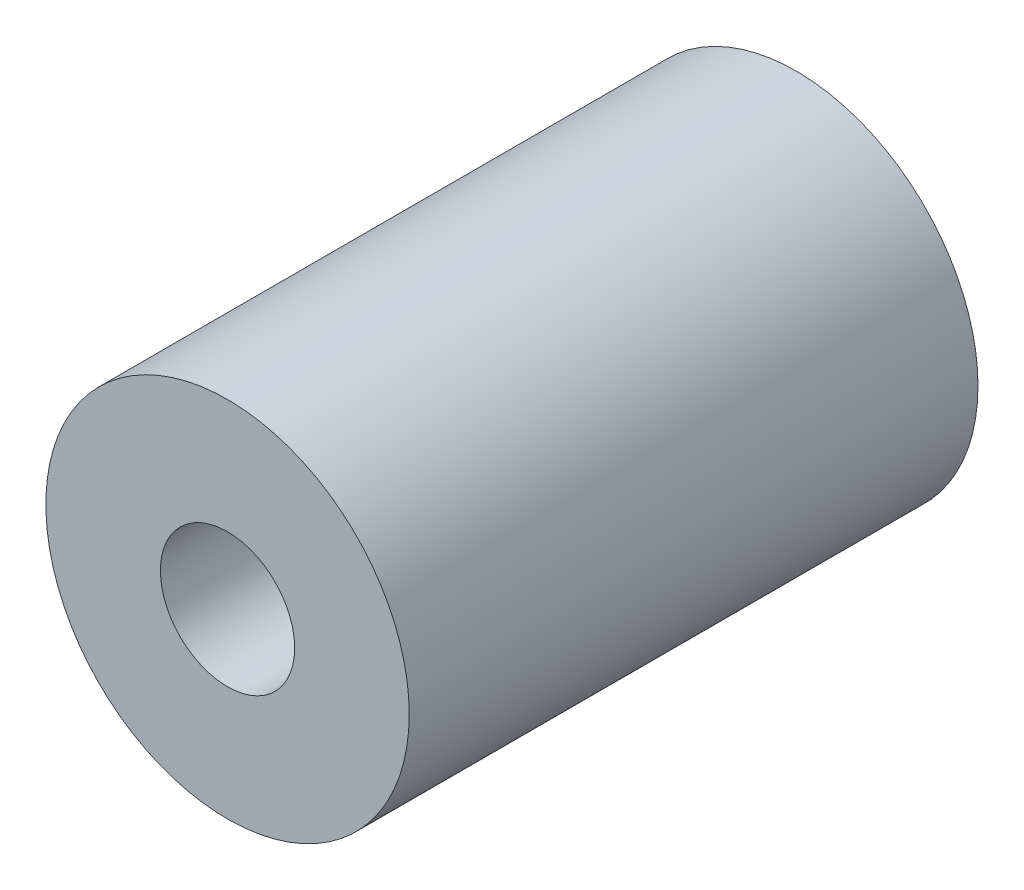
ISO-10303-21;
HEADER;
FILE_DESCRIPTION(('STEP AP214'),'2;1');
FILE_NAME('part.step','',(''),(''),'','','');
FILE_SCHEMA(('AUTOMOTIVE_DESIGN { 1 0 10303 214 1 1 1 1 }'));
ENDSEC;
DATA;
#1=APPLICATION_CONTEXT('core data for automotive mechanical design processes');
#2=APPLICATION_PROTOCOL_DEFINITION('international standard','automotive_design',2000,#1);
#3=PRODUCT_CONTEXT('',#1,'mechanical');
#4=PRODUCT('Part','Part','',(#3));
#5=PRODUCT_RELATED_PRODUCT_CATEGORY('part','',(#4));
#6=PRODUCT_DEFINITION_FORMATION('','',#4);
#7=PRODUCT_DEFINITION_CONTEXT('part definition',#1,'design');
#8=PRODUCT_DEFINITION('design','',#6,#7);
#9=PRODUCT_DEFINITION_SHAPE('','',#8);
#10=(LENGTH_UNIT() NAMED_UNIT(*) SI_UNIT(.MILLI.,.METRE.));
#11=(NAMED_UNIT(*) PLANE_ANGLE_UNIT() SI_UNIT($,.RADIAN.));
#12=(NAMED_UNIT(*) SI_UNIT($,.STERADIAN.) SOLID_ANGLE_UNIT());
#13=UNCERTAINTY_MEASURE_WITH_UNIT(LENGTH_MEASURE(1.E-05),#10,'distance_accuracy_value','');
#14=(GEOMETRIC_REPRESENTATION_CONTEXT(3) GLOBAL_UNCERTAINTY_ASSIGNED_CONTEXT((#13)) GLOBAL_UNIT_ASSIGNED_CONTEXT((#10,
#11,#12)) REPRESENTATION_CONTEXT('',''));
#15=CARTESIAN_POINT('',(0.,0.,0.));
#16=DIRECTION('',(0.,0.,1.));
#17=DIRECTION('',(1.,0.,0.));
#18=AXIS2_PLACEMENT_3D('',#15,#16,#17);
#19=CARTESIAN_POINT('',(0.,0.,7.2));
#20=DIRECTION('',(0.,0.,-1.));
#21=DIRECTION('',(-1.00000000000001,0.,0.));
#22=AXIS2_PLACEMENT_3D('',#19,#20,#21);
#23=CYLINDRICAL_SURFACE('',#22,2.3);
#24=CARTESIAN_POINT('',(0.,0.,7.2));
#25=DIRECTION('',(0.,0.,1.));
#26=DIRECTION('',(1.00000000000001,0.,0.));
#27=AXIS2_PLACEMENT_3D('',#24,#25,#26);
#28=CIRCLE('',#27,2.3);
#29=CARTESIAN_POINT('',(2.30000000000001,0.,7.2));
#30=VERTEX_POINT('',#29);
#31=EDGE_CURVE('E10',#30,#30,#28,.T.);
#32=ORIENTED_EDGE('',*,*,#31,.F.);
#33=EDGE_LOOP('',(#32));
#34=FACE_BOUND('',#33,.T.);
#35=CARTESIAN_POINT('',(0.,0.,0.));
#36=DIRECTION('',(0.,0.,1.));
#37=DIRECTION('',(1.00000000000001,0.,0.));
#38=AXIS2_PLACEMENT_3D('',#35,#36,#37);
#39=CIRCLE('',#38,2.3);
#40=CARTESIAN_POINT('',(2.30000000000001,0.,0.));
#41=VERTEX_POINT('',#40);
#42=EDGE_CURVE('E33',#41,#41,#39,.T.);
#43=ORIENTED_EDGE('',*,*,#42,.T.);
#44=EDGE_LOOP('',(#43));
#45=FACE_BOUND('',#44,.T.);
#46=ADVANCED_FACE('F30',(#34,#45),#23,.T.);
#47=CARTESIAN_POINT('',(0.,0.,7.2));
#48=DIRECTION('',(0.,0.,1.));
#49=DIRECTION('',(1.00000000000001,0.,0.));
#50=AXIS2_PLACEMENT_3D('',#47,#48,#49);
#51=PLANE('',#50);
#52=CARTESIAN_POINT('',(0.,0.,7.2));
#53=DIRECTION('',(0.,0.,1.));
#54=DIRECTION('',(1.00000000000001,0.,0.));
#55=AXIS2_PLACEMENT_3D('',#52,#53,#54);
#56=CIRCLE('',#55,0.85);
#57=CARTESIAN_POINT('',(0.850000000000005,0.,7.2));
#58=VERTEX_POINT('',#57);
#59=EDGE_CURVE('E42',#58,#58,#56,.T.);
#60=ORIENTED_EDGE('',*,*,#59,.F.);
#61=EDGE_LOOP('',(#60));
#62=FACE_BOUND('',#61,.T.);
#63=ORIENTED_EDGE('',*,*,#31,.T.);
#64=EDGE_LOOP('',(#63));
#65=FACE_BOUND('',#64,.T.);
#66=ADVANCED_FACE('F57',(#62,#65),#51,.T.);
#67=CARTESIAN_POINT('',(0.,0.,0.));
#68=DIRECTION('',(0.,0.,1.));
#69=DIRECTION('',(1.00000000000001,0.,0.));
#70=AXIS2_PLACEMENT_3D('',#67,#68,#69);
#71=PLANE('',#70);
#72=ORIENTED_EDGE('',*,*,#42,.F.);
#73=EDGE_LOOP('',(#72));
#74=FACE_BOUND('',#73,.T.);
#75=ADVANCED_FACE('F53',(#74),#71,.F.);
#76=CARTESIAN_POINT('',(0.,0.,3.6));
#77=DIRECTION('',(0.,0.,1.));
#78=DIRECTION('',(1.00000000000001,0.,0.));
#79=AXIS2_PLACEMENT_3D('',#76,#77,#78);
#80=CYLINDRICAL_SURFACE('',#79,0.85);
#81=CARTESIAN_POINT('',(0.,0.,3.6));
#82=DIRECTION('',(0.,0.,1.));
#83=DIRECTION('',(1.00000000000001,0.,0.));
#84=AXIS2_PLACEMENT_3D('',#81,#82,#83);
#85=CIRCLE('',#84,0.85);
#86=CARTESIAN_POINT('',(0.850000000000005,0.,3.6));
#87=VERTEX_POINT('',#86);
#88=EDGE_CURVE('E40',#87,#87,#85,.T.);
#89=ORIENTED_EDGE('',*,*,#88,.F.);
#90=EDGE_LOOP('',(#89));
#91=FACE_BOUND('',#90,.T.);
#92=ORIENTED_EDGE('',*,*,#59,.T.);
#93=EDGE_LOOP('',(#92));
#94=FACE_BOUND('',#93,.T.);
#95=ADVANCED_FACE('F50',(#91,#94),#80,.F.);
#96=CARTESIAN_POINT('',(0.,0.,3.6));
#97=DIRECTION('',(0.,0.,1.));
#98=DIRECTION('',(1.00000000000001,0.,0.));
#99=AXIS2_PLACEMENT_3D('',#96,#97,#98);
#100=PLANE('',#99);
#101=ORIENTED_EDGE('',*,*,#88,.T.);
#102=EDGE_LOOP('',(#101));
#103=FACE_BOUND('',#102,.T.);
#104=ADVANCED_FACE('F48',(#103),#100,.T.);
#105=CLOSED_SHELL('',(#46,#66,#75,#95,#104));
#106=MANIFOLD_SOLID_BREP('B2',#105);
#107=ADVANCED_BREP_SHAPE_REPRESENTATION('',(#18,#106),#14);
#108=SHAPE_DEFINITION_REPRESENTATION(#9,#107);
ENDSEC;
END-ISO-10303-21;
